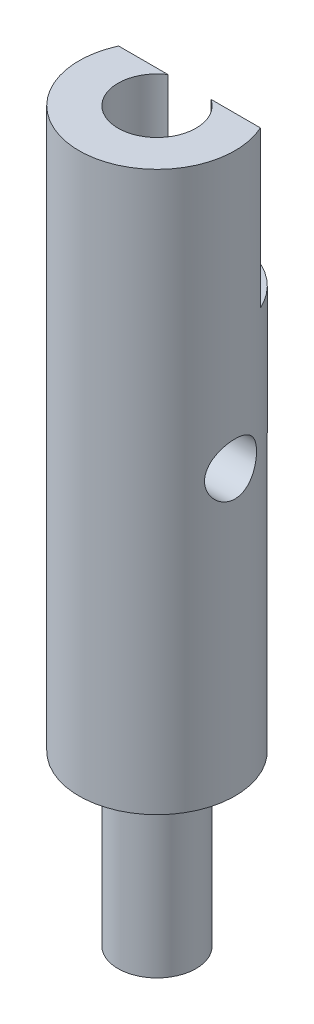
ISO-10303-21;
HEADER;
FILE_DESCRIPTION(('STEP AP214'),'2;1');
FILE_NAME('part.step','',(''),(''),'','','');
FILE_SCHEMA(('AUTOMOTIVE_DESIGN { 1 0 10303 214 1 1 1 1 }'));
ENDSEC;
DATA;
#1=APPLICATION_CONTEXT('core data for automotive mechanical design processes');
#2=APPLICATION_PROTOCOL_DEFINITION('international standard','automotive_design',2000,#1);
#3=PRODUCT_CONTEXT('',#1,'mechanical');
#4=PRODUCT('Part','Part','',(#3));
#5=PRODUCT_RELATED_PRODUCT_CATEGORY('part','',(#4));
#6=PRODUCT_DEFINITION_FORMATION('','',#4);
#7=PRODUCT_DEFINITION_CONTEXT('part definition',#1,'design');
#8=PRODUCT_DEFINITION('design','',#6,#7);
#9=PRODUCT_DEFINITION_SHAPE('','',#8);
#10=(LENGTH_UNIT() NAMED_UNIT(*) SI_UNIT(.MILLI.,.METRE.));
#11=(NAMED_UNIT(*) PLANE_ANGLE_UNIT() SI_UNIT($,.RADIAN.));
#12=(NAMED_UNIT(*) SI_UNIT($,.STERADIAN.) SOLID_ANGLE_UNIT());
#13=UNCERTAINTY_MEASURE_WITH_UNIT(LENGTH_MEASURE(1.E-05),#10,'distance_accuracy_value','');
#14=(GEOMETRIC_REPRESENTATION_CONTEXT(3) GLOBAL_UNCERTAINTY_ASSIGNED_CONTEXT((#13)) GLOBAL_UNIT_ASSIGNED_CONTEXT((#10,
#11,#12)) REPRESENTATION_CONTEXT('',''));
#15=CARTESIAN_POINT('',(0.,0.,0.));
#16=DIRECTION('',(0.,0.,1.));
#17=DIRECTION('',(1.,0.,0.));
#18=AXIS2_PLACEMENT_3D('',#15,#16,#17);
#19=CARTESIAN_POINT('',(0.,56.,0.));
#20=DIRECTION('',(0.,-1.,0.));
#21=DIRECTION('',(0.,0.,-1.));
#22=AXIS2_PLACEMENT_3D('',#19,#20,#21);
#23=CYLINDRICAL_SURFACE('',#22,6.);
#24=CARTESIAN_POINT('',(-6.,32.8,0.));
#25=CARTESIAN_POINT('',(-6.00000030601888,32.7999994925367,-0.109126725773447));
#26=CARTESIAN_POINT('',(-5.9969953901509,32.8089605322544,-0.218250389077101));
#27=CARTESIAN_POINT('',(-5.98530420406562,32.8444582176344,-0.433283521745946));
#28=CARTESIAN_POINT('',(-5.97661734404305,32.8709966878978,-0.539192656237636));
#29=CARTESIAN_POINT('',(-5.95450615812885,32.9406384867681,-0.744665579003552));
#30=CARTESIAN_POINT('',(-5.94108975461707,32.9837141249185,-0.844239651772069));
#31=CARTESIAN_POINT('',(-5.91088891434684,33.0850823456767,-1.03474987361065));
#32=CARTESIAN_POINT('',(-5.89410381335556,33.1433779300052,-1.12568431391741));
#33=CARTESIAN_POINT('',(-5.8582818888601,33.2756516097175,-1.29948335004453));
#34=CARTESIAN_POINT('',(-5.8391911292757,33.350062468521,-1.38200740059662));
#35=CARTESIAN_POINT('',(-5.80120629566243,33.5115343094131,-1.53366538540417));
#36=CARTESIAN_POINT('',(-5.78231226581098,33.598598069857,-1.60279637097893));
#37=CARTESIAN_POINT('',(-5.74626664954548,33.7859702303929,-1.72764988445572));
#38=CARTESIAN_POINT('',(-5.72918078551376,33.8865874794642,-1.78292971644207));
#39=CARTESIAN_POINT('',(-5.69950610837202,34.0963521889171,-1.87563774775545));
#40=CARTESIAN_POINT('',(-5.68691592321491,34.2054970343255,-1.91307139477353));
#41=CARTESIAN_POINT('',(-5.66822606538754,34.4253464429934,-1.96774692301833));
#42=CARTESIAN_POINT('',(-5.66192191539223,34.5358744169781,-1.98562689654354));
#43=CARTESIAN_POINT('',(-5.65591313259015,34.7585275083118,-2.00268224666896));
#44=CARTESIAN_POINT('',(-5.6562064604546,34.8706521214184,-2.00186340320944));
#45=CARTESIAN_POINT('',(-5.6631803001636,35.087873260888,-1.98203980740684));
#46=CARTESIAN_POINT('',(-5.66956831735066,35.193056805838,-1.96386782633399));
#47=CARTESIAN_POINT('',(-5.68753315449102,35.3987868392137,-1.91121232569883));
#48=CARTESIAN_POINT('',(-5.69911059568215,35.4993327708701,-1.87672685318374));
#49=CARTESIAN_POINT('',(-5.72635822262498,35.694825499183,-1.79187811612042));
#50=CARTESIAN_POINT('',(-5.74209131586235,35.7896560509391,-1.74126809741452));
#51=CARTESIAN_POINT('',(-5.77585117151453,35.9697418165595,-1.62577821260627));
#52=CARTESIAN_POINT('',(-5.79387859580927,36.0549942538668,-1.56089422472801));
#53=CARTESIAN_POINT('',(-5.83134658335482,36.2181831963215,-1.41469866536447));
#54=CARTESIAN_POINT('',(-5.85081178709686,36.2955053890181,-1.33270630015262));
#55=CARTESIAN_POINT('',(-5.88813876774073,36.4354625333268,-1.15667913994013));
#56=CARTESIAN_POINT('',(-5.90600039076135,36.498096076329,-1.06264319132163));
#57=CARTESIAN_POINT('',(-5.93834215875587,36.6073926004701,-0.863895226092537));
#58=CARTESIAN_POINT('',(-5.95278700016078,36.6538909826815,-0.759086552832675));
#59=CARTESIAN_POINT('',(-5.9764113428887,36.7284063479114,-0.542538166729015));
#60=CARTESIAN_POINT('',(-5.98559267309759,36.7564297508469,-0.430800876309905));
#61=CARTESIAN_POINT('',(-5.99735254142881,36.7921113320447,-0.208767659058605));
#62=CARTESIAN_POINT('',(-6.00020003667456,36.8005996183455,-0.0986191997296893));
#63=CARTESIAN_POINT('',(-5.99977805389655,36.7993346528031,0.121550139920477));
#64=CARTESIAN_POINT('',(-5.99650960838725,36.7895844800402,0.231571038639303));
#65=CARTESIAN_POINT('',(-5.98440049434209,36.7527761845281,0.445039732608513));
#66=CARTESIAN_POINT('',(-5.97572397422385,36.726227587901,0.548585613669689));
#67=CARTESIAN_POINT('',(-5.9538369366014,36.6572131110665,0.74971191715915));
#68=CARTESIAN_POINT('',(-5.9406258409335,36.6147452010644,0.847291577017216));
#69=CARTESIAN_POINT('',(-5.91057862574579,36.5138591363184,1.03657659278655));
#70=CARTESIAN_POINT('',(-5.89365629511572,36.4550508134337,1.1280599184343));
#71=CARTESIAN_POINT('',(-5.85810507832525,36.323611699973,1.30012966027118));
#72=CARTESIAN_POINT('',(-5.83947567187655,36.2509766879365,1.38071273559116));
#73=CARTESIAN_POINT('',(-5.80153695960889,36.0900424979868,1.5325050156126));
#74=CARTESIAN_POINT('',(-5.78223522174856,36.0011815461463,1.60312193849154));
#75=CARTESIAN_POINT('',(-5.74599946589418,35.8124568643782,1.72851504464715));
#76=CARTESIAN_POINT('',(-5.72906546764005,35.7125930427318,1.78329109586203));
#77=CARTESIAN_POINT('',(-5.69964783582767,35.5046539694202,1.87519386083272));
#78=CARTESIAN_POINT('',(-5.68715521585958,35.3965958416625,1.91235626433004));
#79=CARTESIAN_POINT('',(-5.66821664612899,35.1752426999117,1.96778933351871));
#80=CARTESIAN_POINT('',(-5.66176797247279,35.0619500691913,1.98606850990788));
#81=CARTESIAN_POINT('',(-5.65595717748354,34.8396058079182,2.00255256495469));
#82=CARTESIAN_POINT('',(-5.6562480051483,34.7306353194263,2.0017405146168));
#83=CARTESIAN_POINT('',(-5.66302539647735,34.5144698501559,1.98248458689739));
#84=CARTESIAN_POINT('',(-5.66951159138723,34.4072747640898,1.96404175891717));
#85=CARTESIAN_POINT('',(-5.68769048609783,34.199728673995,1.91074362625869));
#86=CARTESIAN_POINT('',(-5.69928196044955,34.099286349991,1.87620669203103));
#87=CARTESIAN_POINT('',(-5.72632797636937,33.9055451861235,1.7919587315195));
#88=CARTESIAN_POINT('',(-5.74178337526786,33.812247937624,1.74224433710761));
#89=CARTESIAN_POINT('',(-5.77565658452093,33.6310326601542,1.62652138516686));
#90=CARTESIAN_POINT('',(-5.79417423284274,33.5435269962032,1.55989648552917));
#91=CARTESIAN_POINT('',(-5.83166712566506,33.3806203732316,1.4132857662713));
#92=CARTESIAN_POINT('',(-5.85064249824745,33.3052228486238,1.33329616890297));
#93=CARTESIAN_POINT('',(-5.88780061051088,33.1657111754216,1.15848311384138));
#94=CARTESIAN_POINT('',(-5.90592363602513,33.102151304498,1.06320302699946));
#95=CARTESIAN_POINT('',(-5.93851982345224,32.9920191422987,0.86271471481325));
#96=CARTESIAN_POINT('',(-5.9529939181586,32.9454425081559,0.757509036264696));
#97=CARTESIAN_POINT('',(-5.97611030137084,32.8725567350226,0.544987294401949));
#98=CARTESIAN_POINT('',(-5.98498424845045,32.8454350674732,0.437975515352816));
#99=CARTESIAN_POINT('',(-5.99692814128444,32.8091594386457,0.220640832020493));
#100=CARTESIAN_POINT('',(-5.9999996906381,32.8000005130069,0.110318851137492));
#101=CARTESIAN_POINT('',(-6.,32.8,0.));
#102=B_SPLINE_CURVE_WITH_KNOTS('',3,(#24,#25,#26,#27,#28,#29,#30,#31,#32,#33,#34,#35,#36,#37,
#38,#39,#40,#41,#42,#43,#44,#45,#46,#47,#48,#49,#50,#51,#52,#53,#54,#55,#56,#57,#58,#59,#60,#61,
#62,#63,#64,#65,#66,#67,#68,#69,#70,#71,#72,#73,#74,#75,#76,#77,#78,#79,#80,#81,#82,#83,#84,#85,
#86,#87,#88,#89,#90,#91,#92,#93,#94,#95,#96,#97,#98,#99,#100,#101),.UNSPECIFIED.,.T.,.F.,(4,2,2,
2,2,2,2,2,2,2,2,2,2,2,2,2,2,2,2,2,2,2,2,2,2,2,2,2,2,2,2,2,2,2,2,2,2,2,4),(0.,0.326974212052023,
0.653982370535043,0.980445345740549,1.3069727555982,1.64369368565512,1.98048866575061,
2.32696769646941,2.67334089385667,3.00803851483681,3.34263267974971,3.66193653102562,
3.98127861710965,4.30576342310263,4.63034205116415,4.97186611622734,5.31342291933236,
5.65836811300715,6.00319337754417,6.3330716635034,6.66289426328354,6.98316315956428,
7.30347290568208,7.63220799687474,7.96104361643783,8.30482045761504,8.64860016469994,
8.99168027653541,9.3346056941168,9.65991332128517,9.98520158702751,10.3043117416084,
10.6234927635196,10.9566013338361,11.2898042224756,11.635993216702,11.9820936230491,
12.3127311674763,12.6432773207628),.UNSPECIFIED.);
#103=CARTESIAN_POINT('',(-6.,32.8,0.));
#104=VERTEX_POINT('',#103);
#105=EDGE_CURVE('E11',#104,#104,#102,.T.);
#106=ORIENTED_EDGE('',*,*,#105,.T.);
#107=EDGE_LOOP('',(#106));
#108=FACE_BOUND('',#107,.T.);
#109=CARTESIAN_POINT('',(5.65685424949238,34.8,-2.));
#110=CARTESIAN_POINT('',(5.65685389060868,34.6910636503279,-2.00000051589543));
#111=CARTESIAN_POINT('',(5.66003538581715,34.5821304003528,-1.99106956737105));
#112=CARTESIAN_POINT('',(5.6723514816251,34.3674911580115,-1.95570226337762));
#113=CARTESIAN_POINT('',(5.68148706284378,34.2617857002551,-1.9292630243368));
#114=CARTESIAN_POINT('',(5.70456407377583,34.0567462140054,-1.85991097136981));
#115=CARTESIAN_POINT('',(5.71849607942644,33.9574001411146,-1.81703044280649));
#116=CARTESIAN_POINT('',(5.74958244020649,33.7672799029041,-1.71612325688276));
#117=CARTESIAN_POINT('',(5.76673750607225,33.6765076348927,-1.65809325772037));
#118=CARTESIAN_POINT('',(5.80308978814946,33.5025600753234,-1.52610229288576));
#119=CARTESIAN_POINT('',(5.82233789689288,33.4197691426565,-1.45164868275584));
#120=CARTESIAN_POINT('',(5.86027729602006,33.2675863975507,-1.28997533442879));
#121=CARTESIAN_POINT('',(5.87896849657923,33.1981967368353,-1.20275355010475));
#122=CARTESIAN_POINT('',(5.91427733843598,33.0730422053408,-1.01520901593002));
#123=CARTESIAN_POINT('',(5.93082815403211,33.0176800587641,-0.91460382244905));
#124=CARTESIAN_POINT('',(5.95939173541966,32.924816829745,-0.704862445974946));
#125=CARTESIAN_POINT('',(5.97140572406004,32.8873109336462,-0.595728571374421));
#126=CARTESIAN_POINT('',(5.98918150863813,32.8325282907352,-0.376057634866986));
#127=CARTESIAN_POINT('',(5.99514629555118,32.814593107486,-0.265701509705933));
#128=CARTESIAN_POINT('',(6.00087216436496,32.7973674132787,-0.0433957496481755));
#129=CARTESIAN_POINT('',(6.00063484525791,32.7980720966952,0.0685534670877962));
#130=CARTESIAN_POINT('',(5.99412079237463,32.8176885091321,0.286207030387633));
#131=CARTESIAN_POINT('',(5.98808129510235,32.835885056949,0.391984097183318));
#132=CARTESIAN_POINT('',(5.97093934679463,32.8887859619609,0.598886877644348));
#133=CARTESIAN_POINT('',(5.95983655262364,32.9234914379596,0.700012275558436));
#134=CARTESIAN_POINT('',(5.93351340586449,33.0088426346121,0.896304949683949));
#135=CARTESIAN_POINT('',(5.91824085048031,33.059691877093,0.991376441937694));
#136=CARTESIAN_POINT('',(5.88516786077838,33.1757194108973,1.17184865105465));
#137=CARTESIAN_POINT('',(5.86736672402934,33.2409016866553,1.25724666877069));
#138=CARTESIAN_POINT('',(5.83012383699793,33.3873487869194,1.42020173310262));
#139=CARTESIAN_POINT('',(5.81064430337755,33.469226315683,1.49720031413055));
#140=CARTESIAN_POINT('',(5.77294670497801,33.6448974514532,1.63655451919635));
#141=CARTESIAN_POINT('',(5.75472883491231,33.7386928914561,1.69890788656309));
#142=CARTESIAN_POINT('',(5.72141050242225,33.9373072512069,1.80797491007149));
#143=CARTESIAN_POINT('',(5.70635818569496,34.0422642626355,1.85445292724268));
#144=CARTESIAN_POINT('',(5.68163301648769,34.2591427884288,1.92888638653868));
#145=CARTESIAN_POINT('',(5.67195790974185,34.3710613624125,1.95684959149499));
#146=CARTESIAN_POINT('',(5.6595927263117,34.5932767108231,1.99232256419505));
#147=CARTESIAN_POINT('',(5.65660720637512,34.7034188494973,2.00069819101527));
#148=CARTESIAN_POINT('',(5.65713344118369,34.9235522982282,1.99921087781944));
#149=CARTESIAN_POINT('',(5.66064401583629,35.033543632048,1.98935125045353));
#150=CARTESIAN_POINT('',(5.67347236180599,35.2463139314238,1.95245130310462));
#151=CARTESIAN_POINT('',(5.68258650881681,35.3492108603017,1.92601278796137));
#152=CARTESIAN_POINT('',(5.70537107342046,35.5490872124784,1.85742772512094));
#153=CARTESIAN_POINT('',(5.71904229869679,35.6460655831816,1.81527839272685));
#154=CARTESIAN_POINT('',(5.74993755191574,35.834760841694,1.71494868147788));
#155=CARTESIAN_POINT('',(5.76726051331257,35.9262132852836,1.656302236717));
#156=CARTESIAN_POINT('',(5.8033153746193,36.0982921047674,1.52517126111512));
#157=CARTESIAN_POINT('',(5.82204768887589,36.1789152773224,1.45268265099756));
#158=CARTESIAN_POINT('',(5.85990077275698,36.3310559681813,1.29178341180065));
#159=CARTESIAN_POINT('',(5.87899687155793,36.4019487800377,1.2027745410933));
#160=CARTESIAN_POINT('',(5.91453703226218,36.5278322846961,1.01365458280051));
#161=CARTESIAN_POINT('',(5.9309811883539,36.5828235423248,0.913543889729103));
#162=CARTESIAN_POINT('',(5.95928811621206,36.6748402097234,0.705559724864591));
#163=CARTESIAN_POINT('',(5.97118060009062,36.7119825542961,0.597742246642394));
#164=CARTESIAN_POINT('',(5.98917221675549,36.7674554841202,0.376916931692034));
#165=CARTESIAN_POINT('',(5.99527344068038,36.785792859761,0.26391098390778));
#166=CARTESIAN_POINT('',(6.00083726472513,36.8025241552113,0.0416306717200815));
#167=CARTESIAN_POINT('',(6.00059840178878,36.8018149078648,-0.0675694478400377));
#168=CARTESIAN_POINT('',(5.99424393038796,36.7826853837072,-0.284222290000349));
#169=CARTESIAN_POINT('',(5.98812879867152,36.7642665436945,-0.391675153638114));
#170=CARTESIAN_POINT('',(5.97081829908825,36.7108355308481,-0.600084238864118));
#171=CARTESIAN_POINT('',(5.95970516722297,36.6760915692941,-0.701116541825579));
#172=CARTESIAN_POINT('',(5.9335432140899,36.5912449378057,-0.895956701879592));
#173=CARTESIAN_POINT('',(5.91849368096033,36.541139489606,-0.989763248284866));
#174=CARTESIAN_POINT('',(5.88531737655762,36.424860975796,-1.17126803261757));
#175=CARTESIAN_POINT('',(5.86709744983853,36.3581626292367,-1.25861250311522));
#176=CARTESIAN_POINT('',(5.82985977583759,36.2114852176876,-1.42116205254486));
#177=CARTESIAN_POINT('',(5.81084177546194,36.1315019154745,-1.49636324324919));
#178=CARTESIAN_POINT('',(5.77326559651196,35.9567812888261,-1.63548361766624));
#179=CARTESIAN_POINT('',(5.75475455977261,35.8615889780467,-1.6988459319958));
#180=CARTESIAN_POINT('',(5.72120386646031,35.6613311461944,-1.80862868660223));
#181=CARTESIAN_POINT('',(5.70616330322499,35.5562682139407,-1.85505355363895));
#182=CARTESIAN_POINT('',(5.68202668413029,35.3440763519687,-1.92768765640833));
#183=CARTESIAN_POINT('',(5.67269265714365,35.2372554729493,-1.95471581829904));
#184=CARTESIAN_POINT('',(5.66010767079037,35.0202878990666,-1.99086864029853));
#185=CARTESIAN_POINT('',(5.65685461234922,34.9101423651786,-1.99999947839319));
#186=CARTESIAN_POINT('',(5.65685424949238,34.8,-2.));
#187=B_SPLINE_CURVE_WITH_KNOTS('',3,(#109,#110,#111,#112,#113,#114,#115,#116,#117,#118,#119,
#120,#121,#122,#123,#124,#125,#126,#127,#128,#129,#130,#131,#132,#133,#134,#135,#136,#137,#138,
#139,#140,#141,#142,#143,#144,#145,#146,#147,#148,#149,#150,#151,#152,#153,#154,#155,#156,#157,
#158,#159,#160,#161,#162,#163,#164,#165,#166,#167,#168,#169,#170,#171,#172,#173,#174,#175,#176,
#177,#178,#179,#180,#181,#182,#183,#184,#185,#186),.UNSPECIFIED.,.T.,.F.,(4,2,2,2,2,2,2,2,2,2,2,
2,2,2,2,2,2,2,2,2,2,2,2,2,2,2,2,2,2,2,2,2,2,2,2,2,2,2,4),(0.,0.326401169598711,
0.652856110030331,0.978673255001653,1.30456233237089,1.64202674855137,1.97954530343976,
2.32587012287315,2.67210152773579,3.00628637529869,3.34038506604655,3.66138009651139,
3.98239688378474,4.30763309720671,4.63295983748045,4.97360348727836,5.31429959224212,
5.65985279686112,6.00526102713233,6.3350858272888,6.66485071674469,6.98328791537553,
7.30178158293892,7.6303771547143,7.95906971324256,8.30357616342187,8.64807037515066,
8.99027582381704,9.33235766008314,9.65836169355272,9.98433928019563,10.3051391208086,
10.6259970152649,10.9587103904127,11.2915300886526,11.6373780547229,11.9831355653373,
12.3132642432538,12.6432789438093),.UNSPECIFIED.);
#188=CARTESIAN_POINT('',(5.65685424949238,34.8,-2.));
#189=VERTEX_POINT('',#188);
#190=EDGE_CURVE('E47',#189,#189,#187,.T.);
#191=ORIENTED_EDGE('',*,*,#190,.T.);
#192=EDGE_LOOP('',(#191));
#193=FACE_BOUND('',#192,.T.);
#194=DIRECTION('',(0.,1.,0.));
#195=VECTOR('',#194,1.);
#196=CARTESIAN_POINT('',(-5.45435605731786,44.,-2.5));
#197=LINE('',#196,#195);
#198=CARTESIAN_POINT('',(-5.45435605731786,44.,-2.5));
#199=VERTEX_POINT('',#198);
#200=CARTESIAN_POINT('',(-5.45435605731786,56.,-2.5));
#201=VERTEX_POINT('',#200);
#202=EDGE_CURVE('E91',#199,#201,#197,.T.);
#203=ORIENTED_EDGE('',*,*,#202,.F.);
#204=CARTESIAN_POINT('',(0.,44.,0.));
#205=DIRECTION('',(0.,1.,0.));
#206=DIRECTION('',(0.,0.,1.));
#207=AXIS2_PLACEMENT_3D('',#204,#205,#206);
#208=CIRCLE('',#207,6.);
#209=CARTESIAN_POINT('',(5.45435605731786,44.,-2.5));
#210=VERTEX_POINT('',#209);
#211=EDGE_CURVE('E98',#210,#199,#208,.T.);
#212=ORIENTED_EDGE('',*,*,#211,.F.);
#213=DIRECTION('',(0.,1.,0.));
#214=VECTOR('',#213,1.);
#215=CARTESIAN_POINT('',(5.45435605731786,44.,-2.5));
#216=LINE('',#215,#214);
#217=CARTESIAN_POINT('',(5.45435605731786,56.,-2.5));
#218=VERTEX_POINT('',#217);
#219=EDGE_CURVE('E83',#210,#218,#216,.T.);
#220=ORIENTED_EDGE('',*,*,#219,.T.);
#221=CARTESIAN_POINT('',(0.,56.,0.));
#222=DIRECTION('',(0.,1.,0.));
#223=DIRECTION('',(0.,0.,1.));
#224=AXIS2_PLACEMENT_3D('',#221,#222,#223);
#225=CIRCLE('',#224,6.);
#226=EDGE_CURVE('E112',#201,#218,#225,.T.);
#227=ORIENTED_EDGE('',*,*,#226,.F.);
#228=EDGE_LOOP('',(#203,#212,#220,#227));
#229=FACE_BOUND('',#228,.T.);
#230=CARTESIAN_POINT('',(0.,13.,0.));
#231=DIRECTION('',(0.,-1.,0.));
#232=DIRECTION('',(0.,0.,-1.));
#233=AXIS2_PLACEMENT_3D('',#230,#231,#232);
#234=CIRCLE('',#233,6.);
#235=CARTESIAN_POINT('',(0.,13.,-6.));
#236=VERTEX_POINT('',#235);
#237=EDGE_CURVE('E108',#236,#236,#234,.T.);
#238=ORIENTED_EDGE('',*,*,#237,.F.);
#239=EDGE_LOOP('',(#238));
#240=FACE_BOUND('',#239,.T.);
#241=ADVANCED_FACE('F35',(#108,#193,#229,#240),#23,.T.);
#242=CARTESIAN_POINT('',(0.,56.,0.));
#243=DIRECTION('',(0.,1.,0.));
#244=DIRECTION('',(0.,0.,1.));
#245=AXIS2_PLACEMENT_3D('',#242,#243,#244);
#246=PLANE('',#245);
#247=CARTESIAN_POINT('',(0.,56.,0.));
#248=DIRECTION('',(0.,1.,0.));
#249=DIRECTION('',(0.,0.,1.));
#250=AXIS2_PLACEMENT_3D('',#247,#248,#249);
#251=CIRCLE('',#250,3.);
#252=CARTESIAN_POINT('',(-1.6583123951777,56.,-2.5));
#253=VERTEX_POINT('',#252);
#254=CARTESIAN_POINT('',(1.6583123951777,56.,-2.5));
#255=VERTEX_POINT('',#254);
#256=EDGE_CURVE('E54',#253,#255,#251,.T.);
#257=ORIENTED_EDGE('',*,*,#256,.F.);
#258=DIRECTION('',(-1.,0.,0.));
#259=VECTOR('',#258,1.);
#260=CARTESIAN_POINT('',(0.,56.,-2.5));
#261=LINE('',#260,#259);
#262=EDGE_CURVE('E110',#253,#201,#261,.T.);
#263=ORIENTED_EDGE('',*,*,#262,.T.);
#264=ORIENTED_EDGE('',*,*,#226,.T.);
#265=EDGE_CURVE('E86',#218,#255,#261,.T.);
#266=ORIENTED_EDGE('',*,*,#265,.T.);
#267=EDGE_LOOP('',(#257,#263,#264,#266));
#268=FACE_BOUND('',#267,.T.);
#269=ADVANCED_FACE('F142',(#268),#246,.T.);
#270=CARTESIAN_POINT('',(0.,44.,0.));
#271=DIRECTION('',(0.,1.,0.));
#272=DIRECTION('',(0.,0.,1.));
#273=AXIS2_PLACEMENT_3D('',#270,#271,#272);
#274=CYLINDRICAL_SURFACE('',#273,3.);
#275=ORIENTED_EDGE('',*,*,#256,.T.);
#276=DIRECTION('',(0.,1.,0.));
#277=VECTOR('',#276,1.);
#278=CARTESIAN_POINT('',(1.6583123951777,44.,-2.5));
#279=LINE('',#278,#277);
#280=CARTESIAN_POINT('',(1.6583123951777,44.,-2.5));
#281=VERTEX_POINT('',#280);
#282=EDGE_CURVE('E92',#281,#255,#279,.T.);
#283=ORIENTED_EDGE('',*,*,#282,.F.);
#284=CARTESIAN_POINT('',(0.,44.,0.));
#285=DIRECTION('',(0.,1.,0.));
#286=DIRECTION('',(0.,0.,1.));
#287=AXIS2_PLACEMENT_3D('',#284,#285,#286);
#288=CIRCLE('',#287,3.);
#289=CARTESIAN_POINT('',(-1.6583123951777,44.,-2.5));
#290=VERTEX_POINT('',#289);
#291=EDGE_CURVE('E100',#290,#281,#288,.T.);
#292=ORIENTED_EDGE('',*,*,#291,.F.);
#293=DIRECTION('',(0.,1.,0.));
#294=VECTOR('',#293,1.);
#295=CARTESIAN_POINT('',(-1.6583123951777,44.,-2.5));
#296=LINE('',#295,#294);
#297=EDGE_CURVE('E62',#290,#253,#296,.T.);
#298=ORIENTED_EDGE('',*,*,#297,.T.);
#299=EDGE_LOOP('',(#275,#283,#292,#298));
#300=FACE_BOUND('',#299,.T.);
#301=ADVANCED_FACE('F139',(#300),#274,.F.);
#302=CARTESIAN_POINT('',(0.,44.,-2.5));
#303=DIRECTION('',(0.,0.,-1.));
#304=DIRECTION('',(-1.,0.,0.));
#305=AXIS2_PLACEMENT_3D('',#302,#303,#304);
#306=PLANE('',#305);
#307=ORIENTED_EDGE('',*,*,#262,.F.);
#308=ORIENTED_EDGE('',*,*,#297,.F.);
#309=DIRECTION('',(-1.,0.,0.));
#310=VECTOR('',#309,1.);
#311=CARTESIAN_POINT('',(0.,44.,-2.5));
#312=LINE('',#311,#310);
#313=EDGE_CURVE('E102',#290,#199,#312,.T.);
#314=ORIENTED_EDGE('',*,*,#313,.T.);
#315=ORIENTED_EDGE('',*,*,#202,.T.);
#316=EDGE_LOOP('',(#307,#308,#314,#315));
#317=FACE_BOUND('',#316,.T.);
#318=ADVANCED_FACE('F136',(#317),#306,.T.);
#319=ORIENTED_EDGE('',*,*,#265,.F.);
#320=ORIENTED_EDGE('',*,*,#219,.F.);
#321=EDGE_CURVE('E81',#210,#281,#312,.T.);
#322=ORIENTED_EDGE('',*,*,#321,.T.);
#323=ORIENTED_EDGE('',*,*,#282,.T.);
#324=EDGE_LOOP('',(#319,#320,#322,#323));
#325=FACE_BOUND('',#324,.T.);
#326=ADVANCED_FACE('F84',(#325),#306,.T.);
#327=CARTESIAN_POINT('',(0.,44.,0.));
#328=DIRECTION('',(0.,1.,0.));
#329=DIRECTION('',(0.,0.,1.));
#330=AXIS2_PLACEMENT_3D('',#327,#328,#329);
#331=PLANE('',#330);
#332=ORIENTED_EDGE('',*,*,#291,.T.);
#333=ORIENTED_EDGE('',*,*,#321,.F.);
#334=ORIENTED_EDGE('',*,*,#211,.T.);
#335=ORIENTED_EDGE('',*,*,#313,.F.);
#336=EDGE_LOOP('',(#332,#333,#334,#335));
#337=FACE_BOUND('',#336,.T.);
#338=ADVANCED_FACE('F97',(#337),#331,.T.);
#339=CARTESIAN_POINT('',(0.,13.,0.));
#340=DIRECTION('',(0.,-1.,0.));
#341=DIRECTION('',(0.,0.,-1.));
#342=AXIS2_PLACEMENT_3D('',#339,#340,#341);
#343=PLANE('',#342);
#344=CARTESIAN_POINT('',(0.,13.,0.));
#345=DIRECTION('',(0.,-1.,0.));
#346=DIRECTION('',(0.,0.,-1.));
#347=AXIS2_PLACEMENT_3D('',#344,#345,#346);
#348=CIRCLE('',#347,3.);
#349=CARTESIAN_POINT('',(0.,13.,-3.));
#350=VERTEX_POINT('',#349);
#351=EDGE_CURVE('E221',#350,#350,#348,.T.);
#352=ORIENTED_EDGE('',*,*,#351,.F.);
#353=EDGE_LOOP('',(#352));
#354=FACE_BOUND('',#353,.T.);
#355=ORIENTED_EDGE('',*,*,#237,.T.);
#356=EDGE_LOOP('',(#355));
#357=FACE_BOUND('',#356,.T.);
#358=ADVANCED_FACE('F129',(#354,#357),#343,.T.);
#359=CARTESIAN_POINT('',(0.,13.,0.));
#360=DIRECTION('',(0.,-1.,0.));
#361=DIRECTION('',(0.,0.,-1.));
#362=AXIS2_PLACEMENT_3D('',#359,#360,#361);
#363=CYLINDRICAL_SURFACE('',#362,3.);
#364=ORIENTED_EDGE('',*,*,#351,.T.);
#365=EDGE_LOOP('',(#364));
#366=FACE_BOUND('',#365,.T.);
#367=CARTESIAN_POINT('',(0.,0.,0.));
#368=DIRECTION('',(0.,-1.,0.));
#369=DIRECTION('',(0.,0.,-1.));
#370=AXIS2_PLACEMENT_3D('',#367,#368,#369);
#371=CIRCLE('',#370,3.);
#372=CARTESIAN_POINT('',(0.,0.,-3.));
#373=VERTEX_POINT('',#372);
#374=EDGE_CURVE('E219',#373,#373,#371,.T.);
#375=ORIENTED_EDGE('',*,*,#374,.F.);
#376=EDGE_LOOP('',(#375));
#377=FACE_BOUND('',#376,.T.);
#378=ADVANCED_FACE('F125',(#366,#377),#363,.T.);
#379=CARTESIAN_POINT('',(0.,0.,0.));
#380=DIRECTION('',(0.,1.,0.));
#381=DIRECTION('',(0.,0.,1.));
#382=AXIS2_PLACEMENT_3D('',#379,#380,#381);
#383=PLANE('',#382);
#384=ORIENTED_EDGE('',*,*,#374,.T.);
#385=EDGE_LOOP('',(#384));
#386=FACE_BOUND('',#385,.T.);
#387=ADVANCED_FACE('F123',(#386),#383,.F.);
#388=CARTESIAN_POINT('',(-6.,34.8,0.));
#389=DIRECTION('',(1.,0.,0.));
#390=DIRECTION('',(0.,0.,-1.));
#391=AXIS2_PLACEMENT_3D('',#388,#389,#390);
#392=CYLINDRICAL_SURFACE('',#391,2.);
#393=ORIENTED_EDGE('',*,*,#190,.F.);
#394=EDGE_LOOP('',(#393));
#395=FACE_BOUND('',#394,.T.);
#396=ORIENTED_EDGE('',*,*,#105,.F.);
#397=EDGE_LOOP('',(#396));
#398=FACE_BOUND('',#397,.T.);
#399=ADVANCED_FACE('F119',(#395,#398),#392,.F.);
#400=CLOSED_SHELL('',(#241,#269,#301,#318,#326,#338,#358,#378,#387,#399));
#401=MANIFOLD_SOLID_BREP('B2',#400);
#402=ADVANCED_BREP_SHAPE_REPRESENTATION('',(#18,#401),#14);
#403=SHAPE_DEFINITION_REPRESENTATION(#9,#402);
ENDSEC;
END-ISO-10303-21;
